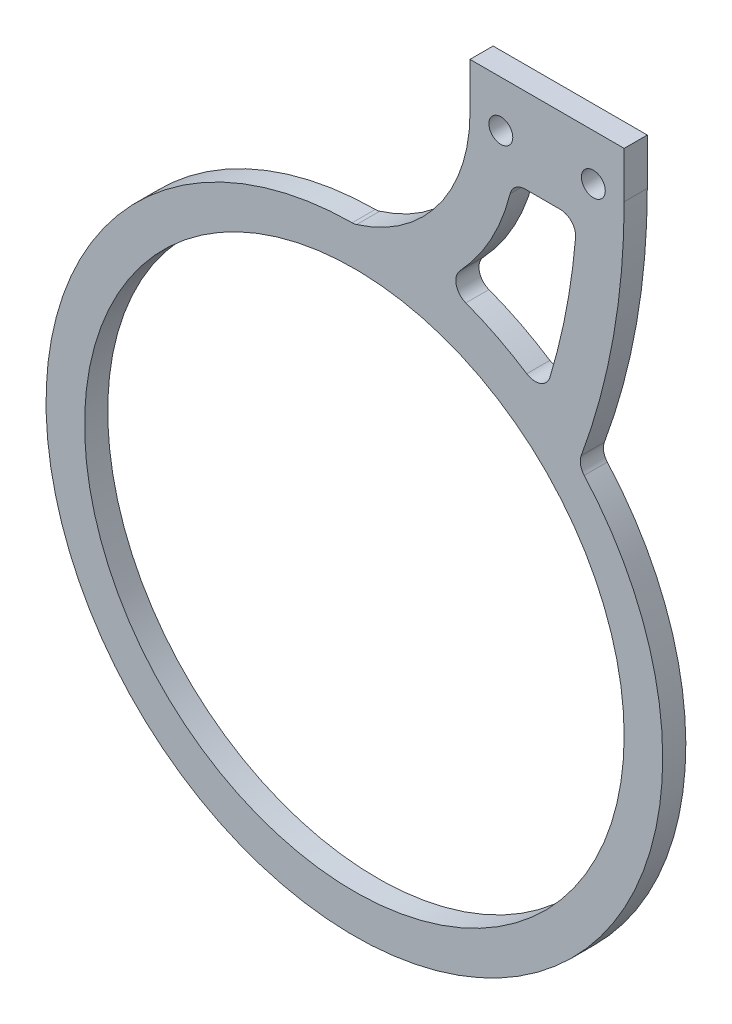
ISO-10303-21;
HEADER;
FILE_DESCRIPTION(('STEP AP214'),'2;1');
FILE_NAME('part.step','',(''),(''),'','','');
FILE_SCHEMA(('AUTOMOTIVE_DESIGN { 1 0 10303 214 1 1 1 1 }'));
ENDSEC;
DATA;
#1=APPLICATION_CONTEXT('core data for automotive mechanical design processes');
#2=APPLICATION_PROTOCOL_DEFINITION('international standard','automotive_design',2000,#1);
#3=PRODUCT_CONTEXT('',#1,'mechanical');
#4=PRODUCT('Part','Part','',(#3));
#5=PRODUCT_RELATED_PRODUCT_CATEGORY('part','',(#4));
#6=PRODUCT_DEFINITION_FORMATION('','',#4);
#7=PRODUCT_DEFINITION_CONTEXT('part definition',#1,'design');
#8=PRODUCT_DEFINITION('design','',#6,#7);
#9=PRODUCT_DEFINITION_SHAPE('','',#8);
#10=(LENGTH_UNIT() NAMED_UNIT(*) SI_UNIT(.MILLI.,.METRE.));
#11=(NAMED_UNIT(*) PLANE_ANGLE_UNIT() SI_UNIT($,.RADIAN.));
#12=(NAMED_UNIT(*) SI_UNIT($,.STERADIAN.) SOLID_ANGLE_UNIT());
#13=UNCERTAINTY_MEASURE_WITH_UNIT(LENGTH_MEASURE(1.E-05),#10,'distance_accuracy_value','');
#14=(GEOMETRIC_REPRESENTATION_CONTEXT(3) GLOBAL_UNCERTAINTY_ASSIGNED_CONTEXT((#13)) GLOBAL_UNIT_ASSIGNED_CONTEXT((#10,
#11,#12)) REPRESENTATION_CONTEXT('',''));
#15=CARTESIAN_POINT('',(0.,0.,0.));
#16=DIRECTION('',(0.,0.,1.));
#17=DIRECTION('',(1.,0.,0.));
#18=AXIS2_PLACEMENT_3D('',#15,#16,#17);
#19=CARTESIAN_POINT('',(-19.,-60.,3.));
#20=DIRECTION('',(0.,0.,-1.));
#21=DIRECTION('',(-1.,0.,0.));
#22=AXIS2_PLACEMENT_3D('',#19,#20,#21);
#23=CYLINDRICAL_SURFACE('',#22,40.);
#24=CARTESIAN_POINT('',(-19.,-60.,3.));
#25=DIRECTION('',(0.,0.,1.));
#26=DIRECTION('',(1.,0.,0.));
#27=AXIS2_PLACEMENT_3D('',#24,#25,#26);
#28=CIRCLE('',#27,40.);
#29=CARTESIAN_POINT('',(-19.2823595765844,-20.0009965990462,3.));
#30=VERTEX_POINT('',#29);
#31=CARTESIAN_POINT('',(10.81425154364,-33.3333465749345,3.));
#32=VERTEX_POINT('',#31);
#33=EDGE_CURVE('E155',#30,#32,#28,.T.);
#34=ORIENTED_EDGE('',*,*,#33,.F.);
#35=DIRECTION('',(0.,0.,-1.));
#36=VECTOR('',#35,1.);
#37=CARTESIAN_POINT('',(-19.2823595765844,-20.0009965990462,3.));
#38=LINE('',#37,#36);
#39=CARTESIAN_POINT('',(-19.2823595765844,-20.0009965990462,0.));
#40=VERTEX_POINT('',#39);
#41=EDGE_CURVE('E242',#30,#40,#38,.T.);
#42=ORIENTED_EDGE('',*,*,#41,.T.);
#43=CARTESIAN_POINT('',(-19.,-60.,0.));
#44=DIRECTION('',(0.,0.,1.));
#45=DIRECTION('',(1.,0.,0.));
#46=AXIS2_PLACEMENT_3D('',#43,#44,#45);
#47=CIRCLE('',#46,40.);
#48=CARTESIAN_POINT('',(10.81425154364,-33.3333465749345,0.));
#49=VERTEX_POINT('',#48);
#50=EDGE_CURVE('E201',#40,#49,#47,.T.);
#51=ORIENTED_EDGE('',*,*,#50,.T.);
#52=DIRECTION('',(0.,0.,-1.));
#53=VECTOR('',#52,1.);
#54=CARTESIAN_POINT('',(10.81425154364,-33.3333465749345,3.));
#55=LINE('',#54,#53);
#56=EDGE_CURVE('E240',#49,#32,#55,.F.);
#57=ORIENTED_EDGE('',*,*,#56,.T.);
#58=EDGE_LOOP('',(#34,#42,#51,#57));
#59=FACE_BOUND('',#58,.T.);
#60=ADVANCED_FACE('F36',(#59),#23,.T.);
#61=CARTESIAN_POINT('',(-74.7504537208818,0.,3.));
#62=DIRECTION('',(0.,0.,-1.));
#63=DIRECTION('',(-1.,0.,0.));
#64=AXIS2_PLACEMENT_3D('',#61,#62,#63);
#65=CYLINDRICAL_SURFACE('',#64,90.7504537208818);
#66=CARTESIAN_POINT('',(-74.7504537208818,0.,3.));
#67=DIRECTION('',(0.,0.,1.));
#68=DIRECTION('',(1.,0.,0.));
#69=AXIS2_PLACEMENT_3D('',#66,#67,#68);
#70=CIRCLE('',#69,90.7504537208818);
#71=CARTESIAN_POINT('',(10.4277675282601,-31.3099900252002,3.));
#72=VERTEX_POINT('',#71);
#73=CARTESIAN_POINT('',(16.,0.,3.));
#74=VERTEX_POINT('',#73);
#75=EDGE_CURVE('E146',#72,#74,#70,.T.);
#76=ORIENTED_EDGE('',*,*,#75,.F.);
#77=DIRECTION('',(0.,0.,-1.));
#78=VECTOR('',#77,1.);
#79=CARTESIAN_POINT('',(10.4277675282601,-31.3099900252002,3.));
#80=LINE('',#79,#78);
#81=CARTESIAN_POINT('',(10.4277675282601,-31.3099900252002,0.));
#82=VERTEX_POINT('',#81);
#83=EDGE_CURVE('E247',#72,#82,#80,.T.);
#84=ORIENTED_EDGE('',*,*,#83,.T.);
#85=CARTESIAN_POINT('',(-74.7504537208818,0.,0.));
#86=DIRECTION('',(0.,0.,1.));
#87=DIRECTION('',(1.,0.,0.));
#88=AXIS2_PLACEMENT_3D('',#85,#86,#87);
#89=CIRCLE('',#88,90.7504537208818);
#90=CARTESIAN_POINT('',(16.,0.,0.));
#91=VERTEX_POINT('',#90);
#92=EDGE_CURVE('E161',#82,#91,#89,.T.);
#93=ORIENTED_EDGE('',*,*,#92,.T.);
#94=DIRECTION('',(0.,0.,-1.));
#95=VECTOR('',#94,1.);
#96=CARTESIAN_POINT('',(16.,0.,3.));
#97=LINE('',#96,#95);
#98=EDGE_CURVE('E158',#74,#91,#97,.T.);
#99=ORIENTED_EDGE('',*,*,#98,.F.);
#100=EDGE_LOOP('',(#76,#84,#93,#99));
#101=FACE_BOUND('',#100,.T.);
#102=ADVANCED_FACE('F159',(#101),#65,.T.);
#103=CARTESIAN_POINT('',(16.,0.,3.));
#104=DIRECTION('',(1.,0.,0.));
#105=DIRECTION('',(0.,0.,-1.));
#106=AXIS2_PLACEMENT_3D('',#103,#104,#105);
#107=PLANE('',#106);
#108=DIRECTION('',(0.,-1.,0.));
#109=VECTOR('',#108,1.);
#110=CARTESIAN_POINT('',(16.,0.,0.));
#111=LINE('',#110,#109);
#112=CARTESIAN_POINT('',(16.,6.,0.));
#113=VERTEX_POINT('',#112);
#114=EDGE_CURVE('E205',#113,#91,#111,.T.);
#115=ORIENTED_EDGE('',*,*,#114,.F.);
#116=DIRECTION('',(0.,0.,-1.));
#117=VECTOR('',#116,1.);
#118=CARTESIAN_POINT('',(16.,6.,3.));
#119=LINE('',#118,#117);
#120=CARTESIAN_POINT('',(16.,6.,3.));
#121=VERTEX_POINT('',#120);
#122=EDGE_CURVE('E166',#121,#113,#119,.T.);
#123=ORIENTED_EDGE('',*,*,#122,.F.);
#124=DIRECTION('',(0.,-1.,0.));
#125=VECTOR('',#124,1.);
#126=CARTESIAN_POINT('',(16.,0.,3.));
#127=LINE('',#126,#125);
#128=EDGE_CURVE('E152',#121,#74,#127,.T.);
#129=ORIENTED_EDGE('',*,*,#128,.T.);
#130=ORIENTED_EDGE('',*,*,#98,.T.);
#131=EDGE_LOOP('',(#115,#123,#129,#130));
#132=FACE_BOUND('',#131,.T.);
#133=ADVANCED_FACE('F168',(#132),#107,.T.);
#134=CARTESIAN_POINT('',(0.,6.,3.));
#135=DIRECTION('',(0.,1.,0.));
#136=DIRECTION('',(-1.,0.,0.));
#137=AXIS2_PLACEMENT_3D('',#134,#135,#136);
#138=PLANE('',#137);
#139=DIRECTION('',(1.,0.,0.));
#140=VECTOR('',#139,1.);
#141=CARTESIAN_POINT('',(0.,6.,0.));
#142=LINE('',#141,#140);
#143=CARTESIAN_POINT('',(-4.,6.,0.));
#144=VERTEX_POINT('',#143);
#145=EDGE_CURVE('E207',#144,#113,#142,.T.);
#146=ORIENTED_EDGE('',*,*,#145,.F.);
#147=DIRECTION('',(0.,0.,-1.));
#148=VECTOR('',#147,1.);
#149=CARTESIAN_POINT('',(-4.,6.,3.));
#150=LINE('',#149,#148);
#151=CARTESIAN_POINT('',(-4.,6.,3.));
#152=VERTEX_POINT('',#151);
#153=EDGE_CURVE('E218',#152,#144,#150,.T.);
#154=ORIENTED_EDGE('',*,*,#153,.F.);
#155=DIRECTION('',(1.,0.,0.));
#156=VECTOR('',#155,1.);
#157=CARTESIAN_POINT('',(0.,6.,3.));
#158=LINE('',#157,#156);
#159=EDGE_CURVE('E169',#152,#121,#158,.T.);
#160=ORIENTED_EDGE('',*,*,#159,.T.);
#161=ORIENTED_EDGE('',*,*,#122,.T.);
#162=EDGE_LOOP('',(#146,#154,#160,#161));
#163=FACE_BOUND('',#162,.T.);
#164=ADVANCED_FACE('F375',(#163),#138,.T.);
#165=CARTESIAN_POINT('',(-4.00000000000001,0.,3.));
#166=DIRECTION('',(-1.,0.,0.));
#167=DIRECTION('',(0.,-1.,0.));
#168=AXIS2_PLACEMENT_3D('',#165,#166,#167);
#169=PLANE('',#168);
#170=DIRECTION('',(0.,1.,0.));
#171=VECTOR('',#170,1.);
#172=CARTESIAN_POINT('',(-4.00000000000001,0.,0.));
#173=LINE('',#172,#171);
#174=CARTESIAN_POINT('',(-4.00000000000001,0.,0.));
#175=VERTEX_POINT('',#174);
#176=EDGE_CURVE('E210',#175,#144,#173,.T.);
#177=ORIENTED_EDGE('',*,*,#176,.F.);
#178=DIRECTION('',(0.,0.,-1.));
#179=VECTOR('',#178,1.);
#180=CARTESIAN_POINT('',(-4.00000000000001,0.,3.));
#181=LINE('',#180,#179);
#182=CARTESIAN_POINT('',(-4.00000000000001,0.,3.));
#183=VERTEX_POINT('',#182);
#184=EDGE_CURVE('E179',#183,#175,#181,.T.);
#185=ORIENTED_EDGE('',*,*,#184,.F.);
#186=DIRECTION('',(0.,1.,0.));
#187=VECTOR('',#186,1.);
#188=CARTESIAN_POINT('',(-4.00000000000001,0.,3.));
#189=LINE('',#188,#187);
#190=EDGE_CURVE('E171',#183,#152,#189,.T.);
#191=ORIENTED_EDGE('',*,*,#190,.T.);
#192=ORIENTED_EDGE('',*,*,#153,.T.);
#193=EDGE_LOOP('',(#177,#185,#191,#192));
#194=FACE_BOUND('',#193,.T.);
#195=ADVANCED_FACE('F317',(#194),#169,.T.);
#196=CARTESIAN_POINT('',(-24.8333333333333,0.,3.));
#197=DIRECTION('',(0.,0.,-1.));
#198=DIRECTION('',(-1.,0.,0.));
#199=AXIS2_PLACEMENT_3D('',#196,#197,#198);
#200=CYLINDRICAL_SURFACE('',#199,26.8333333333333);
#201=CARTESIAN_POINT('',(-24.8333333333333,0.,3.));
#202=DIRECTION('',(0.,0.,1.));
#203=DIRECTION('',(1.,0.,0.));
#204=AXIS2_PLACEMENT_3D('',#201,#202,#203);
#205=CIRCLE('',#204,26.8333333333333);
#206=CARTESIAN_POINT('',(-5.29385171768888,-18.3912053974086,3.));
#207=VERTEX_POINT('',#206);
#208=CARTESIAN_POINT('',(1.19722001611628,-6.51445086705202,3.));
#209=VERTEX_POINT('',#208);
#210=EDGE_CURVE('E215',#207,#209,#205,.T.);
#211=ORIENTED_EDGE('',*,*,#210,.F.);
#212=DIRECTION('',(0.,0.,-1.));
#213=VECTOR('',#212,1.);
#214=CARTESIAN_POINT('',(-5.29385171768887,-18.3912053974086,3.));
#215=LINE('',#214,#213);
#216=CARTESIAN_POINT('',(-5.29385171768888,-18.3912053974086,0.));
#217=VERTEX_POINT('',#216);
#218=EDGE_CURVE('E222',#207,#217,#215,.T.);
#219=ORIENTED_EDGE('',*,*,#218,.T.);
#220=CARTESIAN_POINT('',(-24.8333333333333,0.,0.));
#221=DIRECTION('',(0.,0.,1.));
#222=DIRECTION('',(1.,0.,0.));
#223=AXIS2_PLACEMENT_3D('',#220,#221,#222);
#224=CIRCLE('',#223,26.8333333333333);
#225=CARTESIAN_POINT('',(1.19722001611628,-6.51445086705202,0.));
#226=VERTEX_POINT('',#225);
#227=EDGE_CURVE('E180',#217,#226,#224,.T.);
#228=ORIENTED_EDGE('',*,*,#227,.T.);
#229=DIRECTION('',(0.,0.,-1.));
#230=VECTOR('',#229,1.);
#231=CARTESIAN_POINT('',(1.19722001611629,-6.51445086705202,3.));
#232=LINE('',#231,#230);
#233=EDGE_CURVE('E165',#226,#209,#232,.F.);
#234=ORIENTED_EDGE('',*,*,#233,.T.);
#235=EDGE_LOOP('',(#211,#219,#228,#234));
#236=FACE_BOUND('',#235,.T.);
#237=ADVANCED_FACE('F313',(#236),#200,.T.);
#238=CARTESIAN_POINT('',(0.,-5.,3.));
#239=DIRECTION('',(0.,1.,0.));
#240=DIRECTION('',(0.,0.,1.));
#241=AXIS2_PLACEMENT_3D('',#238,#239,#240);
#242=PLANE('',#241);
#243=DIRECTION('',(1.,0.,0.));
#244=VECTOR('',#243,1.);
#245=CARTESIAN_POINT('',(0.,-5.,0.));
#246=LINE('',#245,#244);
#247=CARTESIAN_POINT('',(3.13738548315601,-5.,0.));
#248=VERTEX_POINT('',#247);
#249=CARTESIAN_POINT('',(7.70339755976973,-5.,0.));
#250=VERTEX_POINT('',#249);
#251=EDGE_CURVE('E183',#248,#250,#246,.T.);
#252=ORIENTED_EDGE('',*,*,#251,.T.);
#253=DIRECTION('',(0.,0.,-1.));
#254=VECTOR('',#253,1.);
#255=CARTESIAN_POINT('',(7.70339755976973,-5.,3.));
#256=LINE('',#255,#254);
#257=CARTESIAN_POINT('',(7.70339755976973,-5.,3.));
#258=VERTEX_POINT('',#257);
#259=EDGE_CURVE('E238',#250,#258,#256,.F.);
#260=ORIENTED_EDGE('',*,*,#259,.T.);
#261=DIRECTION('',(1.,0.,0.));
#262=VECTOR('',#261,1.);
#263=CARTESIAN_POINT('',(0.,-5.,3.));
#264=LINE('',#263,#262);
#265=CARTESIAN_POINT('',(3.13738548315601,-5.,3.));
#266=VERTEX_POINT('',#265);
#267=EDGE_CURVE('E344',#266,#258,#264,.T.);
#268=ORIENTED_EDGE('',*,*,#267,.F.);
#269=DIRECTION('',(0.,0.,1.));
#270=VECTOR('',#269,1.);
#271=CARTESIAN_POINT('',(3.13738548315601,-5.,0.));
#272=LINE('',#271,#270);
#273=EDGE_CURVE('E235',#266,#248,#272,.F.);
#274=ORIENTED_EDGE('',*,*,#273,.T.);
#275=EDGE_LOOP('',(#252,#260,#268,#274));
#276=FACE_BOUND('',#275,.T.);
#277=ADVANCED_FACE('F309',(#276),#242,.F.);
#278=CARTESIAN_POINT('',(-74.7504537208818,0.,3.));
#279=DIRECTION('',(0.,0.,-1.));
#280=DIRECTION('',(-1.,0.,0.));
#281=AXIS2_PLACEMENT_3D('',#278,#279,#280);
#282=CYLINDRICAL_SURFACE('',#281,84.7504537208818);
#283=CARTESIAN_POINT('',(-74.7504537208818,0.,0.));
#284=DIRECTION('',(0.,0.,1.));
#285=DIRECTION('',(1.,0.,0.));
#286=AXIS2_PLACEMENT_3D('',#283,#284,#285);
#287=CIRCLE('',#286,84.7504537208818);
#288=CARTESIAN_POINT('',(6.36953521366182,-24.5394947208545,0.));
#289=VERTEX_POINT('',#288);
#290=CARTESIAN_POINT('',(9.69622896003659,-7.16918336239245,0.));
#291=VERTEX_POINT('',#290);
#292=EDGE_CURVE('E186',#289,#291,#287,.T.);
#293=ORIENTED_EDGE('',*,*,#292,.F.);
#294=DIRECTION('',(0.,0.,-1.));
#295=VECTOR('',#294,1.);
#296=CARTESIAN_POINT('',(6.36953521366183,-24.5394947208545,3.));
#297=LINE('',#296,#295);
#298=CARTESIAN_POINT('',(6.36953521366182,-24.5394947208545,3.));
#299=VERTEX_POINT('',#298);
#300=EDGE_CURVE('E233',#289,#299,#297,.F.);
#301=ORIENTED_EDGE('',*,*,#300,.T.);
#302=CARTESIAN_POINT('',(-74.7504537208818,0.,3.));
#303=DIRECTION('',(0.,0.,1.));
#304=DIRECTION('',(1.,0.,0.));
#305=AXIS2_PLACEMENT_3D('',#302,#303,#304);
#306=CIRCLE('',#305,84.7504537208818);
#307=CARTESIAN_POINT('',(9.69622896003659,-7.16918336239245,3.));
#308=VERTEX_POINT('',#307);
#309=EDGE_CURVE('E349',#299,#308,#306,.T.);
#310=ORIENTED_EDGE('',*,*,#309,.T.);
#311=DIRECTION('',(0.,0.,-1.));
#312=VECTOR('',#311,1.);
#313=CARTESIAN_POINT('',(9.69622896003661,-7.16918336239246,3.));
#314=LINE('',#313,#312);
#315=EDGE_CURVE('E230',#308,#291,#314,.T.);
#316=ORIENTED_EDGE('',*,*,#315,.T.);
#317=EDGE_LOOP('',(#293,#301,#310,#316));
#318=FACE_BOUND('',#317,.T.);
#319=ADVANCED_FACE('F293',(#318),#282,.F.);
#320=CARTESIAN_POINT('',(-19.,-60.,3.));
#321=DIRECTION('',(0.,0.,-1.));
#322=DIRECTION('',(-1.,0.,0.));
#323=AXIS2_PLACEMENT_3D('',#320,#321,#322);
#324=CYLINDRICAL_SURFACE('',#323,35.);
#325=CARTESIAN_POINT('',(-19.,-60.,3.));
#326=DIRECTION('',(0.,0.,1.));
#327=DIRECTION('',(1.,0.,0.));
#328=AXIS2_PLACEMENT_3D('',#325,#326,#327);
#329=CIRCLE('',#328,35.);
#330=CARTESIAN_POINT('',(16.,-60.,3.));
#331=VERTEX_POINT('',#330);
#332=EDGE_CURVE('E363',#331,#331,#329,.T.);
#333=ORIENTED_EDGE('',*,*,#332,.T.);
#334=EDGE_LOOP('',(#333));
#335=FACE_BOUND('',#334,.T.);
#336=CARTESIAN_POINT('',(-19.,-60.,0.));
#337=DIRECTION('',(0.,0.,1.));
#338=DIRECTION('',(1.,0.,0.));
#339=AXIS2_PLACEMENT_3D('',#336,#337,#338);
#340=CIRCLE('',#339,35.);
#341=CARTESIAN_POINT('',(16.,-60.,0.));
#342=VERTEX_POINT('',#341);
#343=EDGE_CURVE('E198',#342,#342,#340,.T.);
#344=ORIENTED_EDGE('',*,*,#343,.F.);
#345=EDGE_LOOP('',(#344));
#346=FACE_BOUND('',#345,.T.);
#347=ADVANCED_FACE('F289',(#335,#346),#324,.F.);
#348=CARTESIAN_POINT('',(12.,0.,3.));
#349=DIRECTION('',(0.,0.,-1.));
#350=DIRECTION('',(-1.,0.,0.));
#351=AXIS2_PLACEMENT_3D('',#348,#349,#350);
#352=CYLINDRICAL_SURFACE('',#351,1.55);
#353=CARTESIAN_POINT('',(12.,0.,3.));
#354=DIRECTION('',(0.,0.,1.));
#355=DIRECTION('',(1.,0.,0.));
#356=AXIS2_PLACEMENT_3D('',#353,#354,#355);
#357=CIRCLE('',#356,1.55);
#358=CARTESIAN_POINT('',(13.55,0.,3.));
#359=VERTEX_POINT('',#358);
#360=EDGE_CURVE('E360',#359,#359,#357,.T.);
#361=ORIENTED_EDGE('',*,*,#360,.T.);
#362=EDGE_LOOP('',(#361));
#363=FACE_BOUND('',#362,.T.);
#364=CARTESIAN_POINT('',(12.,0.,0.));
#365=DIRECTION('',(0.,0.,1.));
#366=DIRECTION('',(1.,0.,0.));
#367=AXIS2_PLACEMENT_3D('',#364,#365,#366);
#368=CIRCLE('',#367,1.55);
#369=CARTESIAN_POINT('',(13.55,0.,0.));
#370=VERTEX_POINT('',#369);
#371=EDGE_CURVE('E195',#370,#370,#368,.T.);
#372=ORIENTED_EDGE('',*,*,#371,.F.);
#373=EDGE_LOOP('',(#372));
#374=FACE_BOUND('',#373,.T.);
#375=ADVANCED_FACE('F292',(#363,#374),#352,.F.);
#376=CARTESIAN_POINT('',(0.,0.,3.));
#377=DIRECTION('',(0.,0.,-1.));
#378=DIRECTION('',(-1.,0.,0.));
#379=AXIS2_PLACEMENT_3D('',#376,#377,#378);
#380=CYLINDRICAL_SURFACE('',#379,1.55);
#381=CARTESIAN_POINT('',(0.,0.,3.));
#382=DIRECTION('',(0.,0.,1.));
#383=DIRECTION('',(1.,0.,0.));
#384=AXIS2_PLACEMENT_3D('',#381,#382,#383);
#385=CIRCLE('',#384,1.55);
#386=CARTESIAN_POINT('',(1.55,0.,3.));
#387=VERTEX_POINT('',#386);
#388=EDGE_CURVE('E357',#387,#387,#385,.T.);
#389=ORIENTED_EDGE('',*,*,#388,.T.);
#390=EDGE_LOOP('',(#389));
#391=FACE_BOUND('',#390,.T.);
#392=CARTESIAN_POINT('',(0.,0.,0.));
#393=DIRECTION('',(0.,0.,1.));
#394=DIRECTION('',(1.,0.,0.));
#395=AXIS2_PLACEMENT_3D('',#392,#393,#394);
#396=CIRCLE('',#395,1.55);
#397=CARTESIAN_POINT('',(1.55,0.,0.));
#398=VERTEX_POINT('',#397);
#399=EDGE_CURVE('E192',#398,#398,#396,.T.);
#400=ORIENTED_EDGE('',*,*,#399,.F.);
#401=EDGE_LOOP('',(#400));
#402=FACE_BOUND('',#401,.T.);
#403=ADVANCED_FACE('F297',(#391,#402),#380,.F.);
#404=CARTESIAN_POINT('',(-19.,-60.,3.));
#405=DIRECTION('',(0.,0.,-1.));
#406=DIRECTION('',(-1.,0.,0.));
#407=AXIS2_PLACEMENT_3D('',#404,#405,#406);
#408=CYLINDRICAL_SURFACE('',#407,41.);
#409=CARTESIAN_POINT('',(-19.,-60.,0.));
#410=DIRECTION('',(0.,0.,1.));
#411=DIRECTION('',(1.,0.,0.));
#412=AXIS2_PLACEMENT_3D('',#409,#410,#411);
#413=CIRCLE('',#412,41.);
#414=CARTESIAN_POINT('',(3.36426946625274,-25.6366554124771,0.));
#415=VERTEX_POINT('',#414);
#416=CARTESIAN_POINT('',(-4.54272573069004,-21.6335143556,0.));
#417=VERTEX_POINT('',#416);
#418=EDGE_CURVE('E189',#415,#417,#413,.T.);
#419=ORIENTED_EDGE('',*,*,#418,.T.);
#420=DIRECTION('',(0.,0.,-1.));
#421=VECTOR('',#420,1.);
#422=CARTESIAN_POINT('',(-4.54272573069004,-21.6335143556,3.));
#423=LINE('',#422,#421);
#424=CARTESIAN_POINT('',(-4.54272573069004,-21.6335143556,3.));
#425=VERTEX_POINT('',#424);
#426=EDGE_CURVE('E228',#417,#425,#423,.F.);
#427=ORIENTED_EDGE('',*,*,#426,.T.);
#428=CARTESIAN_POINT('',(-19.,-60.,3.));
#429=DIRECTION('',(0.,0.,1.));
#430=DIRECTION('',(1.,0.,0.));
#431=AXIS2_PLACEMENT_3D('',#428,#429,#430);
#432=CIRCLE('',#431,41.);
#433=CARTESIAN_POINT('',(3.36426946625274,-25.6366554124771,3.));
#434=VERTEX_POINT('',#433);
#435=EDGE_CURVE('E352',#434,#425,#432,.T.);
#436=ORIENTED_EDGE('',*,*,#435,.F.);
#437=DIRECTION('',(0.,0.,-1.));
#438=VECTOR('',#437,1.);
#439=CARTESIAN_POINT('',(3.36426946625274,-25.6366554124771,3.));
#440=LINE('',#439,#438);
#441=EDGE_CURVE('E225',#434,#415,#440,.T.);
#442=ORIENTED_EDGE('',*,*,#441,.T.);
#443=EDGE_LOOP('',(#419,#427,#436,#442));
#444=FACE_BOUND('',#443,.T.);
#445=ADVANCED_FACE('F301',(#444),#408,.T.);
#446=CARTESIAN_POINT('',(-24.8333333333333,0.,3.));
#447=DIRECTION('',(0.,0.,-1.));
#448=DIRECTION('',(-1.,0.,0.));
#449=AXIS2_PLACEMENT_3D('',#446,#447,#448);
#450=CYLINDRICAL_SURFACE('',#449,20.8333333333333);
#451=CARTESIAN_POINT('',(-24.8333333333333,0.,0.));
#452=DIRECTION('',(0.,0.,1.));
#453=DIRECTION('',(1.,0.,0.));
#454=AXIS2_PLACEMENT_3D('',#451,#452,#453);
#455=CIRCLE('',#454,20.8333333333333);
#456=CARTESIAN_POINT('',(-18.7084928710327,-19.9126619789807,0.));
#457=VERTEX_POINT('',#456);
#458=EDGE_CURVE('E213',#457,#175,#455,.T.);
#459=ORIENTED_EDGE('',*,*,#458,.F.);
#460=DIRECTION('',(0.,0.,-1.));
#461=VECTOR('',#460,1.);
#462=CARTESIAN_POINT('',(-18.7084928710327,-19.9126619789807,3.));
#463=LINE('',#462,#461);
#464=CARTESIAN_POINT('',(-18.7084928710327,-19.9126619789807,3.));
#465=VERTEX_POINT('',#464);
#466=EDGE_CURVE('E245',#457,#465,#463,.F.);
#467=ORIENTED_EDGE('',*,*,#466,.T.);
#468=CARTESIAN_POINT('',(-24.8333333333333,0.,3.));
#469=DIRECTION('',(0.,0.,1.));
#470=DIRECTION('',(1.,0.,0.));
#471=AXIS2_PLACEMENT_3D('',#468,#469,#470);
#472=CIRCLE('',#471,20.8333333333333);
#473=EDGE_CURVE('E177',#465,#183,#472,.T.);
#474=ORIENTED_EDGE('',*,*,#473,.T.);
#475=ORIENTED_EDGE('',*,*,#184,.T.);
#476=EDGE_LOOP('',(#459,#467,#474,#475));
#477=FACE_BOUND('',#476,.T.);
#478=ADVANCED_FACE('F305',(#477),#450,.F.);
#479=CARTESIAN_POINT('',(0.,0.,3.));
#480=DIRECTION('',(0.,0.,1.));
#481=DIRECTION('',(1.,0.,0.));
#482=AXIS2_PLACEMENT_3D('',#479,#480,#481);
#483=PLANE('',#482);
#484=ORIENTED_EDGE('',*,*,#435,.T.);
#485=CARTESIAN_POINT('',(-3.83749283950419,-19.7619784705073,3.));
#486=DIRECTION('',(0.,0.,1.));
#487=DIRECTION('',(1.,0.,0.));
#488=AXIS2_PLACEMENT_3D('',#485,#486,#487);
#489=CIRCLE('',#488,2.);
#490=EDGE_CURVE('E251',#425,#207,#489,.F.);
#491=ORIENTED_EDGE('',*,*,#490,.T.);
#492=ORIENTED_EDGE('',*,*,#210,.T.);
#493=CARTESIAN_POINT('',(3.13738548315601,-7.,3.));
#494=DIRECTION('',(0.,0.,1.));
#495=DIRECTION('',(1.,0.,0.));
#496=AXIS2_PLACEMENT_3D('',#493,#494,#495);
#497=CIRCLE('',#496,2.);
#498=EDGE_CURVE('E263',#209,#266,#497,.F.);
#499=ORIENTED_EDGE('',*,*,#498,.T.);
#500=ORIENTED_EDGE('',*,*,#267,.T.);
#501=CARTESIAN_POINT('',(7.70339755976973,-7.,3.));
#502=DIRECTION('',(0.,0.,1.));
#503=DIRECTION('',(1.,0.,0.));
#504=AXIS2_PLACEMENT_3D('',#501,#502,#503);
#505=CIRCLE('',#504,2.);
#506=EDGE_CURVE('E259',#258,#308,#505,.F.);
#507=ORIENTED_EDGE('',*,*,#506,.T.);
#508=ORIENTED_EDGE('',*,*,#309,.F.);
#509=CARTESIAN_POINT('',(4.45520944021629,-23.9603947008906,3.));
#510=DIRECTION('',(0.,0.,1.));
#511=DIRECTION('',(1.,0.,0.));
#512=AXIS2_PLACEMENT_3D('',#509,#510,#511);
#513=CIRCLE('',#512,2.);
#514=EDGE_CURVE('E255',#299,#434,#513,.F.);
#515=ORIENTED_EDGE('',*,*,#514,.T.);
#516=EDGE_LOOP('',(#484,#491,#492,#499,#500,#507,#508,#515));
#517=FACE_BOUND('',#516,.T.);
#518=ORIENTED_EDGE('',*,*,#388,.F.);
#519=EDGE_LOOP('',(#518));
#520=FACE_BOUND('',#519,.T.);
#521=ORIENTED_EDGE('',*,*,#360,.F.);
#522=EDGE_LOOP('',(#521));
#523=FACE_BOUND('',#522,.T.);
#524=ORIENTED_EDGE('',*,*,#332,.F.);
#525=EDGE_LOOP('',(#524));
#526=FACE_BOUND('',#525,.T.);
#527=ORIENTED_EDGE('',*,*,#473,.F.);
#528=CARTESIAN_POINT('',(-19.2964775554136,-18.0010464289985,3.));
#529=DIRECTION('',(0.,0.,1.));
#530=DIRECTION('',(1.,0.,0.));
#531=AXIS2_PLACEMENT_3D('',#528,#529,#530);
#532=CIRCLE('',#531,2.);
#533=EDGE_CURVE('E267',#465,#30,#532,.F.);
#534=ORIENTED_EDGE('',*,*,#533,.T.);
#535=ORIENTED_EDGE('',*,*,#33,.T.);
#536=CARTESIAN_POINT('',(12.304964120822,-32.0000139036812,3.));
#537=DIRECTION('',(0.,0.,1.));
#538=DIRECTION('',(1.,0.,0.));
#539=AXIS2_PLACEMENT_3D('',#536,#537,#538);
#540=CIRCLE('',#539,2.);
#541=EDGE_CURVE('E11',#32,#72,#540,.F.);
#542=ORIENTED_EDGE('',*,*,#541,.T.);
#543=ORIENTED_EDGE('',*,*,#75,.T.);
#544=ORIENTED_EDGE('',*,*,#128,.F.);
#545=ORIENTED_EDGE('',*,*,#159,.F.);
#546=ORIENTED_EDGE('',*,*,#190,.F.);
#547=EDGE_LOOP('',(#527,#534,#535,#542,#543,#544,#545,#546));
#548=FACE_BOUND('',#547,.T.);
#549=ADVANCED_FACE('F149',(#517,#520,#523,#526,#548),#483,.T.);
#550=CARTESIAN_POINT('',(0.,0.,0.));
#551=DIRECTION('',(0.,0.,1.));
#552=DIRECTION('',(1.,0.,0.));
#553=AXIS2_PLACEMENT_3D('',#550,#551,#552);
#554=PLANE('',#553);
#555=ORIENTED_EDGE('',*,*,#227,.F.);
#556=CARTESIAN_POINT('',(-3.83749283950419,-19.7619784705073,0.));
#557=DIRECTION('',(0.,0.,1.));
#558=DIRECTION('',(1.,0.,0.));
#559=AXIS2_PLACEMENT_3D('',#556,#557,#558);
#560=CIRCLE('',#559,2.);
#561=EDGE_CURVE('E249',#217,#417,#560,.T.);
#562=ORIENTED_EDGE('',*,*,#561,.T.);
#563=ORIENTED_EDGE('',*,*,#418,.F.);
#564=CARTESIAN_POINT('',(4.45520944021629,-23.9603947008906,0.));
#565=DIRECTION('',(0.,0.,1.));
#566=DIRECTION('',(1.,0.,0.));
#567=AXIS2_PLACEMENT_3D('',#564,#565,#566);
#568=CIRCLE('',#567,2.);
#569=EDGE_CURVE('E253',#415,#289,#568,.T.);
#570=ORIENTED_EDGE('',*,*,#569,.T.);
#571=ORIENTED_EDGE('',*,*,#292,.T.);
#572=CARTESIAN_POINT('',(7.70339755976973,-7.,0.));
#573=DIRECTION('',(0.,0.,1.));
#574=DIRECTION('',(1.,0.,0.));
#575=AXIS2_PLACEMENT_3D('',#572,#573,#574);
#576=CIRCLE('',#575,2.);
#577=EDGE_CURVE('E257',#291,#250,#576,.T.);
#578=ORIENTED_EDGE('',*,*,#577,.T.);
#579=ORIENTED_EDGE('',*,*,#251,.F.);
#580=CARTESIAN_POINT('',(3.13738548315601,-7.,0.));
#581=DIRECTION('',(0.,0.,1.));
#582=DIRECTION('',(1.,0.,0.));
#583=AXIS2_PLACEMENT_3D('',#580,#581,#582);
#584=CIRCLE('',#583,2.);
#585=EDGE_CURVE('E261',#248,#226,#584,.T.);
#586=ORIENTED_EDGE('',*,*,#585,.T.);
#587=EDGE_LOOP('',(#555,#562,#563,#570,#571,#578,#579,#586));
#588=FACE_BOUND('',#587,.T.);
#589=ORIENTED_EDGE('',*,*,#399,.T.);
#590=EDGE_LOOP('',(#589));
#591=FACE_BOUND('',#590,.T.);
#592=ORIENTED_EDGE('',*,*,#371,.T.);
#593=EDGE_LOOP('',(#592));
#594=FACE_BOUND('',#593,.T.);
#595=ORIENTED_EDGE('',*,*,#343,.T.);
#596=EDGE_LOOP('',(#595));
#597=FACE_BOUND('',#596,.T.);
#598=ORIENTED_EDGE('',*,*,#50,.F.);
#599=CARTESIAN_POINT('',(-19.2964775554136,-18.0010464289985,0.));
#600=DIRECTION('',(0.,0.,1.));
#601=DIRECTION('',(1.,0.,0.));
#602=AXIS2_PLACEMENT_3D('',#599,#600,#601);
#603=CIRCLE('',#602,2.);
#604=EDGE_CURVE('E265',#40,#457,#603,.T.);
#605=ORIENTED_EDGE('',*,*,#604,.T.);
#606=ORIENTED_EDGE('',*,*,#458,.T.);
#607=ORIENTED_EDGE('',*,*,#176,.T.);
#608=ORIENTED_EDGE('',*,*,#145,.T.);
#609=ORIENTED_EDGE('',*,*,#114,.T.);
#610=ORIENTED_EDGE('',*,*,#92,.F.);
#611=CARTESIAN_POINT('',(12.304964120822,-32.0000139036812,0.));
#612=DIRECTION('',(0.,0.,1.));
#613=DIRECTION('',(1.,0.,0.));
#614=AXIS2_PLACEMENT_3D('',#611,#612,#613);
#615=CIRCLE('',#614,2.);
#616=EDGE_CURVE('E44',#82,#49,#615,.T.);
#617=ORIENTED_EDGE('',*,*,#616,.T.);
#618=EDGE_LOOP('',(#598,#605,#606,#607,#608,#609,#610,#617));
#619=FACE_BOUND('',#618,.T.);
#620=ADVANCED_FACE('F270',(#588,#591,#594,#597,#619),#554,.F.);
#621=CARTESIAN_POINT('',(-3.83749283950419,-19.7619784705073,3.));
#622=DIRECTION('',(0.,0.,1.));
#623=DIRECTION('',(1.,0.,0.));
#624=AXIS2_PLACEMENT_3D('',#621,#622,#623);
#625=CYLINDRICAL_SURFACE('',#624,2.);
#626=ORIENTED_EDGE('',*,*,#490,.F.);
#627=ORIENTED_EDGE('',*,*,#426,.F.);
#628=ORIENTED_EDGE('',*,*,#561,.F.);
#629=ORIENTED_EDGE('',*,*,#218,.F.);
#630=EDGE_LOOP('',(#626,#627,#628,#629));
#631=FACE_BOUND('',#630,.T.);
#632=ADVANCED_FACE('F319',(#631),#625,.F.);
#633=CARTESIAN_POINT('',(4.45520944021629,-23.9603947008906,3.));
#634=DIRECTION('',(0.,0.,-1.));
#635=DIRECTION('',(-1.,0.,0.));
#636=AXIS2_PLACEMENT_3D('',#633,#634,#635);
#637=CYLINDRICAL_SURFACE('',#636,2.);
#638=ORIENTED_EDGE('',*,*,#514,.F.);
#639=ORIENTED_EDGE('',*,*,#300,.F.);
#640=ORIENTED_EDGE('',*,*,#569,.F.);
#641=ORIENTED_EDGE('',*,*,#441,.F.);
#642=EDGE_LOOP('',(#638,#639,#640,#641));
#643=FACE_BOUND('',#642,.T.);
#644=ADVANCED_FACE('F322',(#643),#637,.F.);
#645=CARTESIAN_POINT('',(7.70339755976973,-7.,3.));
#646=DIRECTION('',(0.,0.,-1.));
#647=DIRECTION('',(-1.,0.,0.));
#648=AXIS2_PLACEMENT_3D('',#645,#646,#647);
#649=CYLINDRICAL_SURFACE('',#648,2.);
#650=ORIENTED_EDGE('',*,*,#506,.F.);
#651=ORIENTED_EDGE('',*,*,#259,.F.);
#652=ORIENTED_EDGE('',*,*,#577,.F.);
#653=ORIENTED_EDGE('',*,*,#315,.F.);
#654=EDGE_LOOP('',(#650,#651,#652,#653));
#655=FACE_BOUND('',#654,.T.);
#656=ADVANCED_FACE('F326',(#655),#649,.F.);
#657=CARTESIAN_POINT('',(3.13738548315601,-7.,3.));
#658=DIRECTION('',(0.,0.,-1.));
#659=DIRECTION('',(-1.,0.,0.));
#660=AXIS2_PLACEMENT_3D('',#657,#658,#659);
#661=CYLINDRICAL_SURFACE('',#660,2.);
#662=ORIENTED_EDGE('',*,*,#498,.F.);
#663=ORIENTED_EDGE('',*,*,#233,.F.);
#664=ORIENTED_EDGE('',*,*,#585,.F.);
#665=ORIENTED_EDGE('',*,*,#273,.F.);
#666=EDGE_LOOP('',(#662,#663,#664,#665));
#667=FACE_BOUND('',#666,.T.);
#668=ADVANCED_FACE('F279',(#667),#661,.F.);
#669=CARTESIAN_POINT('',(-19.2964775554136,-18.0010464289985,3.));
#670=DIRECTION('',(0.,0.,-1.));
#671=DIRECTION('',(-1.,0.,0.));
#672=AXIS2_PLACEMENT_3D('',#669,#670,#671);
#673=CYLINDRICAL_SURFACE('',#672,2.);
#674=ORIENTED_EDGE('',*,*,#533,.F.);
#675=ORIENTED_EDGE('',*,*,#466,.F.);
#676=ORIENTED_EDGE('',*,*,#604,.F.);
#677=ORIENTED_EDGE('',*,*,#41,.F.);
#678=EDGE_LOOP('',(#674,#675,#676,#677));
#679=FACE_BOUND('',#678,.T.);
#680=ADVANCED_FACE('F275',(#679),#673,.F.);
#681=CARTESIAN_POINT('',(12.304964120822,-32.0000139036812,3.));
#682=DIRECTION('',(0.,0.,1.));
#683=DIRECTION('',(1.,0.,0.));
#684=AXIS2_PLACEMENT_3D('',#681,#682,#683);
#685=CYLINDRICAL_SURFACE('',#684,2.);
#686=ORIENTED_EDGE('',*,*,#541,.F.);
#687=ORIENTED_EDGE('',*,*,#56,.F.);
#688=ORIENTED_EDGE('',*,*,#616,.F.);
#689=ORIENTED_EDGE('',*,*,#83,.F.);
#690=EDGE_LOOP('',(#686,#687,#688,#689));
#691=FACE_BOUND('',#690,.T.);
#692=ADVANCED_FACE('F38',(#691),#685,.F.);
#693=CLOSED_SHELL('',(#60,#102,#133,#164,#195,#237,#277,#319,#347,#375,#403,#445,#478,#549,#620,
#632,#644,#656,#668,#680,#692));
#694=MANIFOLD_SOLID_BREP('B2',#693);
#695=ADVANCED_BREP_SHAPE_REPRESENTATION('',(#18,#694),#14);
#696=SHAPE_DEFINITION_REPRESENTATION(#9,#695);
ENDSEC;
END-ISO-10303-21;
